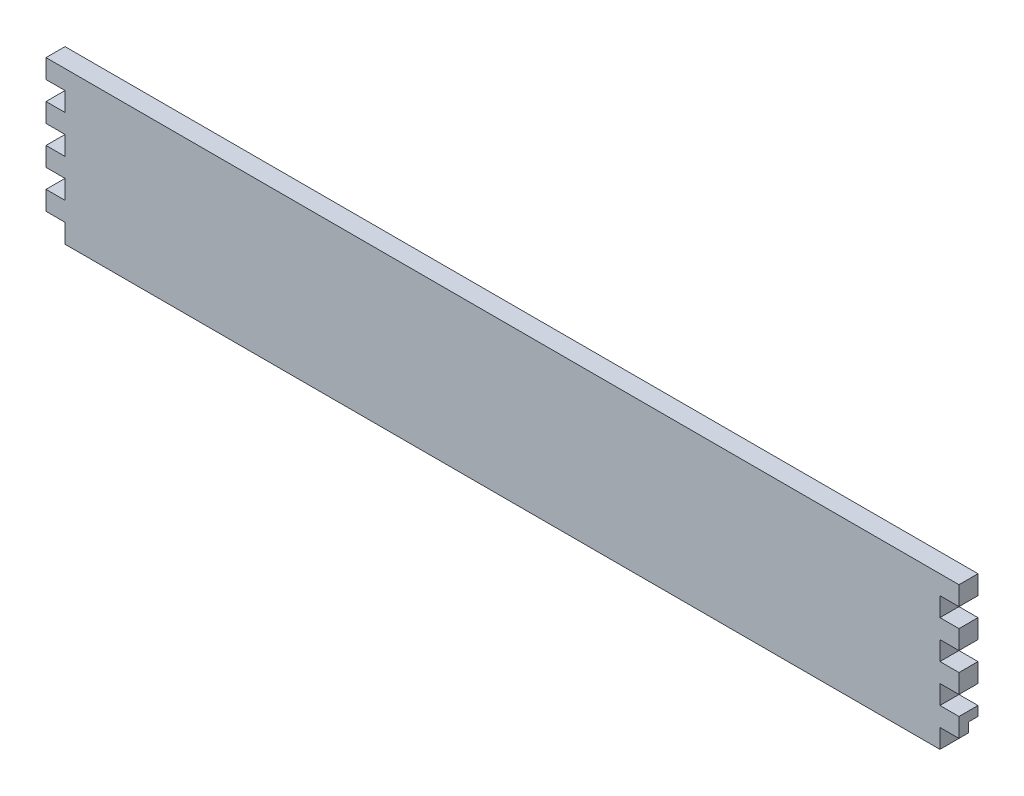
ISO-10303-21;
HEADER;
FILE_DESCRIPTION(('STEP AP214'),'2;1');
FILE_NAME('part.step','',(''),(''),'','','');
FILE_SCHEMA(('AUTOMOTIVE_DESIGN { 1 0 10303 214 1 1 1 1 }'));
ENDSEC;
DATA;
#1=APPLICATION_CONTEXT('core data for automotive mechanical design processes');
#2=APPLICATION_PROTOCOL_DEFINITION('international standard','automotive_design',2000,#1);
#3=PRODUCT_CONTEXT('',#1,'mechanical');
#4=PRODUCT('Part','Part','',(#3));
#5=PRODUCT_RELATED_PRODUCT_CATEGORY('part','',(#4));
#6=PRODUCT_DEFINITION_FORMATION('','',#4);
#7=PRODUCT_DEFINITION_CONTEXT('part definition',#1,'design');
#8=PRODUCT_DEFINITION('design','',#6,#7);
#9=PRODUCT_DEFINITION_SHAPE('','',#8);
#10=(LENGTH_UNIT() NAMED_UNIT(*) SI_UNIT(.MILLI.,.METRE.));
#11=(NAMED_UNIT(*) PLANE_ANGLE_UNIT() SI_UNIT($,.RADIAN.));
#12=(NAMED_UNIT(*) SI_UNIT($,.STERADIAN.) SOLID_ANGLE_UNIT());
#13=UNCERTAINTY_MEASURE_WITH_UNIT(LENGTH_MEASURE(1.E-05),#10,'distance_accuracy_value','');
#14=(GEOMETRIC_REPRESENTATION_CONTEXT(3) GLOBAL_UNCERTAINTY_ASSIGNED_CONTEXT((#13)) GLOBAL_UNIT_ASSIGNED_CONTEXT((#10,
#11,#12)) REPRESENTATION_CONTEXT('',''));
#15=CARTESIAN_POINT('',(0.,0.,0.));
#16=DIRECTION('',(0.,0.,1.));
#17=DIRECTION('',(1.,0.,0.));
#18=AXIS2_PLACEMENT_3D('',#15,#16,#17);
#19=CARTESIAN_POINT('',(0.,0.,12.7));
#20=DIRECTION('',(-1.,0.,0.));
#21=DIRECTION('',(0.,-1.,0.));
#22=AXIS2_PLACEMENT_3D('',#19,#20,#21);
#23=PLANE('',#22);
#24=DIRECTION('',(0.,1.,0.));
#25=VECTOR('',#24,1.);
#26=CARTESIAN_POINT('',(0.,0.,0.));
#27=LINE('',#26,#25);
#28=CARTESIAN_POINT('',(-2.22044604925031E-13,19.0499999999999,0.));
#29=VERTEX_POINT('',#28);
#30=CARTESIAN_POINT('',(0.,25.4,0.));
#31=VERTEX_POINT('',#30);
#32=EDGE_CURVE('E310',#29,#31,#27,.T.);
#33=ORIENTED_EDGE('',*,*,#32,.F.);
#34=DIRECTION('',(0.,0.,1.));
#35=VECTOR('',#34,1.);
#36=CARTESIAN_POINT('',(0.,19.0499999999999,12.7));
#37=LINE('',#36,#35);
#38=CARTESIAN_POINT('',(0.,19.0499999999999,6.35));
#39=VERTEX_POINT('',#38);
#40=EDGE_CURVE('E434',#29,#39,#37,.T.);
#41=ORIENTED_EDGE('',*,*,#40,.T.);
#42=DIRECTION('',(0.,-1.,0.));
#43=VECTOR('',#42,1.);
#44=CARTESIAN_POINT('',(0.,0.,6.35));
#45=LINE('',#44,#43);
#46=CARTESIAN_POINT('',(0.,12.6999999999999,6.35));
#47=VERTEX_POINT('',#46);
#48=EDGE_CURVE('E271',#39,#47,#45,.T.);
#49=ORIENTED_EDGE('',*,*,#48,.T.);
#50=DIRECTION('',(0.,0.,-1.));
#51=VECTOR('',#50,1.);
#52=CARTESIAN_POINT('',(0.,12.7,12.7));
#53=LINE('',#52,#51);
#54=CARTESIAN_POINT('',(0.,12.7,12.7));
#55=VERTEX_POINT('',#54);
#56=EDGE_CURVE('E382',#55,#47,#53,.T.);
#57=ORIENTED_EDGE('',*,*,#56,.F.);
#58=DIRECTION('',(0.,1.,0.));
#59=VECTOR('',#58,1.);
#60=CARTESIAN_POINT('',(0.,0.,12.7));
#61=LINE('',#60,#59);
#62=CARTESIAN_POINT('',(0.,25.4,12.7));
#63=VERTEX_POINT('',#62);
#64=EDGE_CURVE('E613',#55,#63,#61,.T.);
#65=ORIENTED_EDGE('',*,*,#64,.T.);
#66=DIRECTION('',(0.,0.,-1.));
#67=VECTOR('',#66,1.);
#68=CARTESIAN_POINT('',(0.,25.4,12.7));
#69=LINE('',#68,#67);
#70=EDGE_CURVE('E385',#63,#31,#69,.T.);
#71=ORIENTED_EDGE('',*,*,#70,.T.);
#72=EDGE_LOOP('',(#33,#41,#49,#57,#65,#71));
#73=FACE_BOUND('',#72,.T.);
#74=ADVANCED_FACE('F33',(#73),#23,.T.);
#75=CARTESIAN_POINT('',(0.,12.7,12.7));
#76=DIRECTION('',(0.,1.,0.));
#77=DIRECTION('',(0.,0.,1.));
#78=AXIS2_PLACEMENT_3D('',#75,#76,#77);
#79=PLANE('',#78);
#80=DIRECTION('',(1.,0.,0.));
#81=VECTOR('',#80,1.);
#82=CARTESIAN_POINT('',(626.282293205179,12.7,6.35));
#83=LINE('',#82,#81);
#84=CARTESIAN_POINT('',(12.7,12.6999999999999,6.35));
#85=VERTEX_POINT('',#84);
#86=EDGE_CURVE('E651',#47,#85,#83,.T.);
#87=ORIENTED_EDGE('',*,*,#86,.T.);
#88=DIRECTION('',(0.,0.,-1.));
#89=VECTOR('',#88,1.);
#90=CARTESIAN_POINT('',(12.7,12.7,12.7));
#91=LINE('',#90,#89);
#92=CARTESIAN_POINT('',(12.7,12.7,12.7));
#93=VERTEX_POINT('',#92);
#94=EDGE_CURVE('E379',#93,#85,#91,.T.);
#95=ORIENTED_EDGE('',*,*,#94,.F.);
#96=DIRECTION('',(1.,0.,0.));
#97=VECTOR('',#96,1.);
#98=CARTESIAN_POINT('',(0.,12.7,12.7));
#99=LINE('',#98,#97);
#100=EDGE_CURVE('E616',#55,#93,#99,.T.);
#101=ORIENTED_EDGE('',*,*,#100,.F.);
#102=ORIENTED_EDGE('',*,*,#56,.T.);
#103=EDGE_LOOP('',(#87,#95,#101,#102));
#104=FACE_BOUND('',#103,.T.);
#105=ADVANCED_FACE('F499',(#104),#79,.F.);
#106=CARTESIAN_POINT('',(0.,12.7000000000036,12.7));
#107=DIRECTION('',(0.,-1.,0.));
#108=DIRECTION('',(1.,0.,0.));
#109=AXIS2_PLACEMENT_3D('',#106,#107,#108);
#110=PLANE('',#109);
#111=DIRECTION('',(0.,0.,-1.));
#112=VECTOR('',#111,1.);
#113=CARTESIAN_POINT('',(596.9,12.7000000000001,12.7));
#114=LINE('',#113,#112);
#115=CARTESIAN_POINT('',(596.9,12.7000000000001,12.7));
#116=VERTEX_POINT('',#115);
#117=CARTESIAN_POINT('',(596.9,12.7,6.35));
#118=VERTEX_POINT('',#117);
#119=EDGE_CURVE('E371',#116,#118,#114,.T.);
#120=ORIENTED_EDGE('',*,*,#119,.T.);
#121=CARTESIAN_POINT('',(609.6,12.7,6.35));
#122=VERTEX_POINT('',#121);
#123=EDGE_CURVE('E634',#118,#122,#83,.T.);
#124=ORIENTED_EDGE('',*,*,#123,.T.);
#125=DIRECTION('',(0.,0.,-1.));
#126=VECTOR('',#125,1.);
#127=CARTESIAN_POINT('',(609.6,12.7,12.7));
#128=LINE('',#127,#126);
#129=CARTESIAN_POINT('',(609.6,12.7,12.7));
#130=VERTEX_POINT('',#129);
#131=EDGE_CURVE('E368',#130,#122,#128,.T.);
#132=ORIENTED_EDGE('',*,*,#131,.F.);
#133=DIRECTION('',(-1.,0.,0.));
#134=VECTOR('',#133,1.);
#135=CARTESIAN_POINT('',(0.,12.7000000000036,12.7));
#136=LINE('',#135,#134);
#137=EDGE_CURVE('E458',#130,#116,#136,.T.);
#138=ORIENTED_EDGE('',*,*,#137,.T.);
#139=EDGE_LOOP('',(#120,#124,#132,#138));
#140=FACE_BOUND('',#139,.T.);
#141=ADVANCED_FACE('F506',(#140),#110,.T.);
#142=CARTESIAN_POINT('',(609.6,0.,12.7));
#143=DIRECTION('',(-1.,0.,0.));
#144=DIRECTION('',(0.,0.,1.));
#145=AXIS2_PLACEMENT_3D('',#142,#143,#144);
#146=PLANE('',#145);
#147=DIRECTION('',(0.,0.,1.));
#148=VECTOR('',#147,1.);
#149=CARTESIAN_POINT('',(609.6,19.05,12.7));
#150=LINE('',#149,#148);
#151=CARTESIAN_POINT('',(609.6,19.05,0.));
#152=VERTEX_POINT('',#151);
#153=CARTESIAN_POINT('',(609.6,19.05,6.35));
#154=VERTEX_POINT('',#153);
#155=EDGE_CURVE('E430',#152,#154,#150,.T.);
#156=ORIENTED_EDGE('',*,*,#155,.F.);
#157=DIRECTION('',(0.,1.,0.));
#158=VECTOR('',#157,1.);
#159=CARTESIAN_POINT('',(609.6,0.,0.));
#160=LINE('',#159,#158);
#161=CARTESIAN_POINT('',(609.6,25.4,0.));
#162=VERTEX_POINT('',#161);
#163=EDGE_CURVE('E320',#152,#162,#160,.T.);
#164=ORIENTED_EDGE('',*,*,#163,.T.);
#165=DIRECTION('',(0.,0.,-1.));
#166=VECTOR('',#165,1.);
#167=CARTESIAN_POINT('',(609.6,25.4,12.7));
#168=LINE('',#167,#166);
#169=CARTESIAN_POINT('',(609.6,25.4,12.7));
#170=VERTEX_POINT('',#169);
#171=EDGE_CURVE('E365',#170,#162,#168,.T.);
#172=ORIENTED_EDGE('',*,*,#171,.F.);
#173=DIRECTION('',(0.,1.,0.));
#174=VECTOR('',#173,1.);
#175=CARTESIAN_POINT('',(609.6,0.,12.7));
#176=LINE('',#175,#174);
#177=EDGE_CURVE('E456',#130,#170,#176,.T.);
#178=ORIENTED_EDGE('',*,*,#177,.F.);
#179=ORIENTED_EDGE('',*,*,#131,.T.);
#180=DIRECTION('',(0.,-1.,0.));
#181=VECTOR('',#180,1.);
#182=CARTESIAN_POINT('',(609.6,0.,6.35));
#183=LINE('',#182,#181);
#184=EDGE_CURVE('E11',#154,#122,#183,.T.);
#185=ORIENTED_EDGE('',*,*,#184,.F.);
#186=EDGE_LOOP('',(#156,#164,#172,#178,#179,#185));
#187=FACE_BOUND('',#186,.T.);
#188=ADVANCED_FACE('F442',(#187),#146,.F.);
#189=CARTESIAN_POINT('',(0.,0.,0.));
#190=DIRECTION('',(0.,0.,1.));
#191=DIRECTION('',(1.,0.,0.));
#192=AXIS2_PLACEMENT_3D('',#189,#190,#191);
#193=PLANE('',#192);
#194=DIRECTION('',(1.,0.,0.));
#195=VECTOR('',#194,1.);
#196=CARTESIAN_POINT('',(0.,19.0499999999999,0.));
#197=LINE('',#196,#195);
#198=EDGE_CURVE('E42',#29,#152,#197,.T.);
#199=ORIENTED_EDGE('',*,*,#198,.F.);
#200=ORIENTED_EDGE('',*,*,#32,.T.);
#201=DIRECTION('',(1.,0.,0.));
#202=VECTOR('',#201,1.);
#203=CARTESIAN_POINT('',(0.,25.4,0.));
#204=LINE('',#203,#202);
#205=CARTESIAN_POINT('',(12.7,25.4,0.));
#206=VERTEX_POINT('',#205);
#207=EDGE_CURVE('E307',#31,#206,#204,.T.);
#208=ORIENTED_EDGE('',*,*,#207,.T.);
#209=DIRECTION('',(0.,-1.,0.));
#210=VECTOR('',#209,1.);
#211=CARTESIAN_POINT('',(12.7,0.,0.));
#212=LINE('',#211,#210);
#213=CARTESIAN_POINT('',(12.6999999999999,38.1,0.));
#214=VERTEX_POINT('',#213);
#215=EDGE_CURVE('E304',#214,#206,#212,.T.);
#216=ORIENTED_EDGE('',*,*,#215,.F.);
#217=DIRECTION('',(1.,0.,0.));
#218=VECTOR('',#217,1.);
#219=CARTESIAN_POINT('',(0.,38.1,0.));
#220=LINE('',#219,#218);
#221=CARTESIAN_POINT('',(0.,38.1,0.));
#222=VERTEX_POINT('',#221);
#223=EDGE_CURVE('E302',#222,#214,#220,.T.);
#224=ORIENTED_EDGE('',*,*,#223,.F.);
#225=DIRECTION('',(0.,1.,0.));
#226=VECTOR('',#225,1.);
#227=CARTESIAN_POINT('',(0.,0.,0.));
#228=LINE('',#227,#226);
#229=CARTESIAN_POINT('',(-1.33025439105324E-13,50.8,0.));
#230=VERTEX_POINT('',#229);
#231=EDGE_CURVE('E299',#222,#230,#228,.T.);
#232=ORIENTED_EDGE('',*,*,#231,.T.);
#233=DIRECTION('',(1.,0.,0.));
#234=VECTOR('',#233,1.);
#235=CARTESIAN_POINT('',(0.,50.8,0.));
#236=LINE('',#235,#234);
#237=CARTESIAN_POINT('',(12.6999999999999,50.8,0.));
#238=VERTEX_POINT('',#237);
#239=EDGE_CURVE('E296',#230,#238,#236,.T.);
#240=ORIENTED_EDGE('',*,*,#239,.T.);
#241=DIRECTION('',(0.,-1.,0.));
#242=VECTOR('',#241,1.);
#243=CARTESIAN_POINT('',(12.7,0.,0.));
#244=LINE('',#243,#242);
#245=CARTESIAN_POINT('',(12.6999999999998,63.5,0.));
#246=VERTEX_POINT('',#245);
#247=EDGE_CURVE('E293',#246,#238,#244,.T.);
#248=ORIENTED_EDGE('',*,*,#247,.F.);
#249=DIRECTION('',(1.,0.,0.));
#250=VECTOR('',#249,1.);
#251=CARTESIAN_POINT('',(0.,63.5,0.));
#252=LINE('',#251,#250);
#253=CARTESIAN_POINT('',(-1.77367249934617E-13,63.5,0.));
#254=VERTEX_POINT('',#253);
#255=EDGE_CURVE('E291',#254,#246,#252,.T.);
#256=ORIENTED_EDGE('',*,*,#255,.F.);
#257=DIRECTION('',(0.,1.,0.));
#258=VECTOR('',#257,1.);
#259=CARTESIAN_POINT('',(0.,0.,0.));
#260=LINE('',#259,#258);
#261=CARTESIAN_POINT('',(-2.21709067381355E-13,76.2,0.));
#262=VERTEX_POINT('',#261);
#263=EDGE_CURVE('E288',#254,#262,#260,.T.);
#264=ORIENTED_EDGE('',*,*,#263,.T.);
#265=DIRECTION('',(1.,0.,0.));
#266=VECTOR('',#265,1.);
#267=CARTESIAN_POINT('',(0.,76.2,0.));
#268=LINE('',#267,#266);
#269=CARTESIAN_POINT('',(12.6999999999998,76.2,0.));
#270=VERTEX_POINT('',#269);
#271=EDGE_CURVE('E285',#262,#270,#268,.T.);
#272=ORIENTED_EDGE('',*,*,#271,.T.);
#273=DIRECTION('',(0.,-1.,0.));
#274=VECTOR('',#273,1.);
#275=CARTESIAN_POINT('',(12.7,0.,0.));
#276=LINE('',#275,#274);
#277=CARTESIAN_POINT('',(12.6999999999997,88.9,0.));
#278=VERTEX_POINT('',#277);
#279=EDGE_CURVE('E282',#278,#270,#276,.T.);
#280=ORIENTED_EDGE('',*,*,#279,.F.);
#281=DIRECTION('',(1.,0.,0.));
#282=VECTOR('',#281,1.);
#283=CARTESIAN_POINT('',(0.,88.9,0.));
#284=LINE('',#283,#282);
#285=CARTESIAN_POINT('',(-2.66050878210648E-13,88.9,0.));
#286=VERTEX_POINT('',#285);
#287=EDGE_CURVE('E280',#286,#278,#284,.T.);
#288=ORIENTED_EDGE('',*,*,#287,.F.);
#289=DIRECTION('',(0.,1.,0.));
#290=VECTOR('',#289,1.);
#291=CARTESIAN_POINT('',(-2.12840702415877E-12,0.,0.));
#292=LINE('',#291,#290);
#293=CARTESIAN_POINT('',(0.,101.6,0.));
#294=VERTEX_POINT('',#293);
#295=EDGE_CURVE('E277',#286,#294,#292,.T.);
#296=ORIENTED_EDGE('',*,*,#295,.T.);
#297=DIRECTION('',(1.,0.,0.));
#298=VECTOR('',#297,1.);
#299=CARTESIAN_POINT('',(0.,101.6,0.));
#300=LINE('',#299,#298);
#301=CARTESIAN_POINT('',(609.6,101.6,0.));
#302=VERTEX_POINT('',#301);
#303=EDGE_CURVE('E274',#294,#302,#300,.T.);
#304=ORIENTED_EDGE('',*,*,#303,.T.);
#305=DIRECTION('',(0.,1.,0.));
#306=VECTOR('',#305,1.);
#307=CARTESIAN_POINT('',(609.599999999998,-1.06581410364015E-11,0.));
#308=LINE('',#307,#306);
#309=CARTESIAN_POINT('',(609.6,88.9,0.));
#310=VERTEX_POINT('',#309);
#311=EDGE_CURVE('E270',#310,#302,#308,.T.);
#312=ORIENTED_EDGE('',*,*,#311,.F.);
#313=DIRECTION('',(-1.,0.,0.));
#314=VECTOR('',#313,1.);
#315=CARTESIAN_POINT('',(4.85722573273522E-13,88.9000000000033,0.));
#316=LINE('',#315,#314);
#317=CARTESIAN_POINT('',(596.9,88.9000000000001,0.));
#318=VERTEX_POINT('',#317);
#319=EDGE_CURVE('E268',#310,#318,#316,.T.);
#320=ORIENTED_EDGE('',*,*,#319,.T.);
#321=DIRECTION('',(0.,-1.,0.));
#322=VECTOR('',#321,1.);
#323=CARTESIAN_POINT('',(596.9,0.,0.));
#324=LINE('',#323,#322);
#325=CARTESIAN_POINT('',(596.9,76.2000000000001,0.));
#326=VERTEX_POINT('',#325);
#327=EDGE_CURVE('E345',#318,#326,#324,.T.);
#328=ORIENTED_EDGE('',*,*,#327,.T.);
#329=DIRECTION('',(-1.,0.,0.));
#330=VECTOR('',#329,1.);
#331=CARTESIAN_POINT('',(4.1633363423445E-13,76.2000000000033,0.));
#332=LINE('',#331,#330);
#333=CARTESIAN_POINT('',(609.6,76.2,0.));
#334=VERTEX_POINT('',#333);
#335=EDGE_CURVE('E343',#334,#326,#332,.T.);
#336=ORIENTED_EDGE('',*,*,#335,.F.);
#337=DIRECTION('',(0.,1.,0.));
#338=VECTOR('',#337,1.);
#339=CARTESIAN_POINT('',(609.6,0.,0.));
#340=LINE('',#339,#338);
#341=CARTESIAN_POINT('',(609.6,63.5,0.));
#342=VERTEX_POINT('',#341);
#343=EDGE_CURVE('E257',#342,#334,#340,.T.);
#344=ORIENTED_EDGE('',*,*,#343,.F.);
#345=DIRECTION('',(-1.,0.,0.));
#346=VECTOR('',#345,1.);
#347=CARTESIAN_POINT('',(3.46944695195378E-13,63.5000000000033,0.));
#348=LINE('',#347,#346);
#349=CARTESIAN_POINT('',(596.9,63.5000000000001,0.));
#350=VERTEX_POINT('',#349);
#351=EDGE_CURVE('E339',#342,#350,#348,.T.);
#352=ORIENTED_EDGE('',*,*,#351,.T.);
#353=DIRECTION('',(0.,-1.,0.));
#354=VECTOR('',#353,1.);
#355=CARTESIAN_POINT('',(596.9,5.21804821573824E-12,0.));
#356=LINE('',#355,#354);
#357=CARTESIAN_POINT('',(596.9,50.8000000000001,0.));
#358=VERTEX_POINT('',#357);
#359=EDGE_CURVE('E336',#350,#358,#356,.T.);
#360=ORIENTED_EDGE('',*,*,#359,.T.);
#361=DIRECTION('',(-1.,0.,0.));
#362=VECTOR('',#361,1.);
#363=CARTESIAN_POINT('',(3.05311331771939E-13,50.8000000000037,0.));
#364=LINE('',#363,#362);
#365=CARTESIAN_POINT('',(609.6,50.8,0.));
#366=VERTEX_POINT('',#365);
#367=EDGE_CURVE('E333',#366,#358,#364,.T.);
#368=ORIENTED_EDGE('',*,*,#367,.F.);
#369=DIRECTION('',(0.,1.,0.));
#370=VECTOR('',#369,1.);
#371=CARTESIAN_POINT('',(609.6,0.,0.));
#372=LINE('',#371,#370);
#373=CARTESIAN_POINT('',(609.6,38.1,0.));
#374=VERTEX_POINT('',#373);
#375=EDGE_CURVE('E331',#374,#366,#372,.T.);
#376=ORIENTED_EDGE('',*,*,#375,.F.);
#377=DIRECTION('',(-1.,0.,0.));
#378=VECTOR('',#377,1.);
#379=CARTESIAN_POINT('',(2.2898349882896E-13,38.1000000000037,0.));
#380=LINE('',#379,#378);
#381=CARTESIAN_POINT('',(596.9,38.1000000000001,0.));
#382=VERTEX_POINT('',#381);
#383=EDGE_CURVE('E328',#374,#382,#380,.T.);
#384=ORIENTED_EDGE('',*,*,#383,.T.);
#385=DIRECTION('',(0.,-1.,0.));
#386=VECTOR('',#385,1.);
#387=CARTESIAN_POINT('',(596.9,0.,0.));
#388=LINE('',#387,#386);
#389=CARTESIAN_POINT('',(596.9,25.4000000000001,0.));
#390=VERTEX_POINT('',#389);
#391=EDGE_CURVE('E325',#382,#390,#388,.T.);
#392=ORIENTED_EDGE('',*,*,#391,.T.);
#393=DIRECTION('',(-1.,0.,0.));
#394=VECTOR('',#393,1.);
#395=CARTESIAN_POINT('',(1.45716771982071E-13,25.4000000000035,0.));
#396=LINE('',#395,#394);
#397=EDGE_CURVE('E322',#162,#390,#396,.T.);
#398=ORIENTED_EDGE('',*,*,#397,.F.);
#399=ORIENTED_EDGE('',*,*,#163,.F.);
#400=EDGE_LOOP('',(#199,#200,#208,#216,#224,#232,#240,#248,#256,#264,#272,#280,#288,#296,#304,
#312,#320,#328,#336,#344,#352,#360,#368,#376,#384,#392,#398,#399));
#401=FACE_BOUND('',#400,.T.);
#402=ADVANCED_FACE('F447',(#401),#193,.F.);
#403=DIRECTION('',(-1.,0.,0.));
#404=VECTOR('',#403,1.);
#405=CARTESIAN_POINT('',(0.,12.6999999999999,0.));
#406=LINE('',#405,#404);
#407=CARTESIAN_POINT('',(596.9,12.7000000000001,0.));
#408=VERTEX_POINT('',#407);
#409=CARTESIAN_POINT('',(12.7,12.6999999999999,0.));
#410=VERTEX_POINT('',#409);
#411=EDGE_CURVE('E418',#408,#410,#406,.T.);
#412=ORIENTED_EDGE('',*,*,#411,.F.);
#413=DIRECTION('',(0.,-1.,0.));
#414=VECTOR('',#413,1.);
#415=CARTESIAN_POINT('',(596.9,0.,0.));
#416=LINE('',#415,#414);
#417=CARTESIAN_POINT('',(596.9,0.,0.));
#418=VERTEX_POINT('',#417);
#419=EDGE_CURVE('E317',#408,#418,#416,.T.);
#420=ORIENTED_EDGE('',*,*,#419,.T.);
#421=DIRECTION('',(1.,0.,0.));
#422=VECTOR('',#421,1.);
#423=CARTESIAN_POINT('',(0.,0.,0.));
#424=LINE('',#423,#422);
#425=CARTESIAN_POINT('',(12.7,0.,0.));
#426=VERTEX_POINT('',#425);
#427=EDGE_CURVE('E314',#426,#418,#424,.T.);
#428=ORIENTED_EDGE('',*,*,#427,.F.);
#429=DIRECTION('',(0.,-1.,0.));
#430=VECTOR('',#429,1.);
#431=CARTESIAN_POINT('',(12.7,0.,0.));
#432=LINE('',#431,#430);
#433=EDGE_CURVE('E312',#410,#426,#432,.T.);
#434=ORIENTED_EDGE('',*,*,#433,.F.);
#435=EDGE_LOOP('',(#412,#420,#428,#434));
#436=FACE_BOUND('',#435,.T.);
#437=ADVANCED_FACE('F569',(#436),#193,.F.);
#438=CARTESIAN_POINT('',(4.85722573273522E-13,88.9000000000033,12.7));
#439=DIRECTION('',(0.,-1.,0.));
#440=DIRECTION('',(1.,0.,0.));
#441=AXIS2_PLACEMENT_3D('',#438,#439,#440);
#442=PLANE('',#441);
#443=ORIENTED_EDGE('',*,*,#319,.F.);
#444=DIRECTION('',(0.,0.,-1.));
#445=VECTOR('',#444,1.);
#446=CARTESIAN_POINT('',(609.6,88.9,12.7));
#447=LINE('',#446,#445);
#448=CARTESIAN_POINT('',(609.6,88.9,12.7));
#449=VERTEX_POINT('',#448);
#450=EDGE_CURVE('E150',#449,#310,#447,.T.);
#451=ORIENTED_EDGE('',*,*,#450,.F.);
#452=DIRECTION('',(-1.,0.,0.));
#453=VECTOR('',#452,1.);
#454=CARTESIAN_POINT('',(4.85722573273522E-13,88.9000000000033,12.7));
#455=LINE('',#454,#453);
#456=CARTESIAN_POINT('',(596.9,88.9000000000001,12.7));
#457=VERTEX_POINT('',#456);
#458=EDGE_CURVE('E348',#449,#457,#455,.T.);
#459=ORIENTED_EDGE('',*,*,#458,.T.);
#460=DIRECTION('',(0.,0.,-1.));
#461=VECTOR('',#460,1.);
#462=CARTESIAN_POINT('',(596.9,88.9000000000001,12.7));
#463=LINE('',#462,#461);
#464=EDGE_CURVE('E50',#457,#318,#463,.T.);
#465=ORIENTED_EDGE('',*,*,#464,.T.);
#466=EDGE_LOOP('',(#443,#451,#459,#465));
#467=FACE_BOUND('',#466,.T.);
#468=ADVANCED_FACE('F35',(#467),#442,.T.);
#469=CARTESIAN_POINT('',(609.599999999998,-1.06581410364015E-11,12.7));
#470=DIRECTION('',(-1.,0.,0.));
#471=DIRECTION('',(0.,-1.,0.));
#472=AXIS2_PLACEMENT_3D('',#469,#470,#471);
#473=PLANE('',#472);
#474=ORIENTED_EDGE('',*,*,#311,.T.);
#475=DIRECTION('',(0.,0.,-1.));
#476=VECTOR('',#475,1.);
#477=CARTESIAN_POINT('',(609.6,101.6,12.7));
#478=LINE('',#477,#476);
#479=CARTESIAN_POINT('',(609.6,101.6,12.7));
#480=VERTEX_POINT('',#479);
#481=EDGE_CURVE('E415',#480,#302,#478,.T.);
#482=ORIENTED_EDGE('',*,*,#481,.F.);
#483=DIRECTION('',(0.,1.,0.));
#484=VECTOR('',#483,1.);
#485=CARTESIAN_POINT('',(609.599999999998,-1.06581410364015E-11,12.7));
#486=LINE('',#485,#484);
#487=EDGE_CURVE('E580',#449,#480,#486,.T.);
#488=ORIENTED_EDGE('',*,*,#487,.F.);
#489=ORIENTED_EDGE('',*,*,#450,.T.);
#490=EDGE_LOOP('',(#474,#482,#488,#489));
#491=FACE_BOUND('',#490,.T.);
#492=ADVANCED_FACE('F562',(#491),#473,.F.);
#493=CARTESIAN_POINT('',(0.,101.6,12.7));
#494=DIRECTION('',(0.,1.,0.));
#495=DIRECTION('',(0.,0.,1.));
#496=AXIS2_PLACEMENT_3D('',#493,#494,#495);
#497=PLANE('',#496);
#498=ORIENTED_EDGE('',*,*,#303,.F.);
#499=DIRECTION('',(0.,0.,-1.));
#500=VECTOR('',#499,1.);
#501=CARTESIAN_POINT('',(0.,101.6,12.7));
#502=LINE('',#501,#500);
#503=CARTESIAN_POINT('',(0.,101.6,12.7));
#504=VERTEX_POINT('',#503);
#505=EDGE_CURVE('E413',#504,#294,#502,.T.);
#506=ORIENTED_EDGE('',*,*,#505,.F.);
#507=DIRECTION('',(1.,0.,0.));
#508=VECTOR('',#507,1.);
#509=CARTESIAN_POINT('',(0.,101.6,12.7));
#510=LINE('',#509,#508);
#511=EDGE_CURVE('E576',#504,#480,#510,.T.);
#512=ORIENTED_EDGE('',*,*,#511,.T.);
#513=ORIENTED_EDGE('',*,*,#481,.T.);
#514=EDGE_LOOP('',(#498,#506,#512,#513));
#515=FACE_BOUND('',#514,.T.);
#516=ADVANCED_FACE('F559',(#515),#497,.T.);
#517=CARTESIAN_POINT('',(-2.12840702415877E-12,0.,12.7));
#518=DIRECTION('',(-1.,0.,0.));
#519=DIRECTION('',(0.,-1.,0.));
#520=AXIS2_PLACEMENT_3D('',#517,#518,#519);
#521=PLANE('',#520);
#522=ORIENTED_EDGE('',*,*,#295,.F.);
#523=DIRECTION('',(0.,0.,-1.));
#524=VECTOR('',#523,1.);
#525=CARTESIAN_POINT('',(-2.66050878210648E-13,88.9,12.7));
#526=LINE('',#525,#524);
#527=CARTESIAN_POINT('',(-2.66050878210648E-13,88.9,12.7));
#528=VERTEX_POINT('',#527);
#529=EDGE_CURVE('E411',#528,#286,#526,.T.);
#530=ORIENTED_EDGE('',*,*,#529,.F.);
#531=DIRECTION('',(0.,1.,0.));
#532=VECTOR('',#531,1.);
#533=CARTESIAN_POINT('',(-2.12840702415877E-12,0.,12.7));
#534=LINE('',#533,#532);
#535=EDGE_CURVE('E579',#528,#504,#534,.T.);
#536=ORIENTED_EDGE('',*,*,#535,.T.);
#537=ORIENTED_EDGE('',*,*,#505,.T.);
#538=EDGE_LOOP('',(#522,#530,#536,#537));
#539=FACE_BOUND('',#538,.T.);
#540=ADVANCED_FACE('F555',(#539),#521,.T.);
#541=CARTESIAN_POINT('',(0.,88.9,12.7));
#542=DIRECTION('',(0.,1.,0.));
#543=DIRECTION('',(0.,0.,1.));
#544=AXIS2_PLACEMENT_3D('',#541,#542,#543);
#545=PLANE('',#544);
#546=ORIENTED_EDGE('',*,*,#287,.T.);
#547=DIRECTION('',(0.,0.,-1.));
#548=VECTOR('',#547,1.);
#549=CARTESIAN_POINT('',(12.6999999999997,88.9,12.7));
#550=LINE('',#549,#548);
#551=CARTESIAN_POINT('',(12.6999999999997,88.9,12.7));
#552=VERTEX_POINT('',#551);
#553=EDGE_CURVE('E408',#552,#278,#550,.T.);
#554=ORIENTED_EDGE('',*,*,#553,.F.);
#555=DIRECTION('',(1.,0.,0.));
#556=VECTOR('',#555,1.);
#557=CARTESIAN_POINT('',(0.,88.9,12.7));
#558=LINE('',#557,#556);
#559=EDGE_CURVE('E582',#528,#552,#558,.T.);
#560=ORIENTED_EDGE('',*,*,#559,.F.);
#561=ORIENTED_EDGE('',*,*,#529,.T.);
#562=EDGE_LOOP('',(#546,#554,#560,#561));
#563=FACE_BOUND('',#562,.T.);
#564=ADVANCED_FACE('F551',(#563),#545,.F.);
#565=CARTESIAN_POINT('',(12.7,0.,12.7));
#566=DIRECTION('',(1.,0.,0.));
#567=DIRECTION('',(0.,1.,0.));
#568=AXIS2_PLACEMENT_3D('',#565,#566,#567);
#569=PLANE('',#568);
#570=ORIENTED_EDGE('',*,*,#279,.T.);
#571=DIRECTION('',(0.,0.,-1.));
#572=VECTOR('',#571,1.);
#573=CARTESIAN_POINT('',(12.6999999999998,76.2,12.7));
#574=LINE('',#573,#572);
#575=CARTESIAN_POINT('',(12.6999999999998,76.2,12.7));
#576=VERTEX_POINT('',#575);
#577=EDGE_CURVE('E406',#576,#270,#574,.T.);
#578=ORIENTED_EDGE('',*,*,#577,.F.);
#579=DIRECTION('',(0.,-1.,0.));
#580=VECTOR('',#579,1.);
#581=CARTESIAN_POINT('',(12.7,0.,12.7));
#582=LINE('',#581,#580);
#583=EDGE_CURVE('E588',#552,#576,#582,.T.);
#584=ORIENTED_EDGE('',*,*,#583,.F.);
#585=ORIENTED_EDGE('',*,*,#553,.T.);
#586=EDGE_LOOP('',(#570,#578,#584,#585));
#587=FACE_BOUND('',#586,.T.);
#588=ADVANCED_FACE('F547',(#587),#569,.F.);
#589=CARTESIAN_POINT('',(0.,76.2,12.7));
#590=DIRECTION('',(0.,1.,0.));
#591=DIRECTION('',(0.,0.,1.));
#592=AXIS2_PLACEMENT_3D('',#589,#590,#591);
#593=PLANE('',#592);
#594=ORIENTED_EDGE('',*,*,#271,.F.);
#595=DIRECTION('',(0.,0.,-1.));
#596=VECTOR('',#595,1.);
#597=CARTESIAN_POINT('',(-2.21709067381355E-13,76.2,12.7));
#598=LINE('',#597,#596);
#599=CARTESIAN_POINT('',(-2.21709067381355E-13,76.2,12.7));
#600=VERTEX_POINT('',#599);
#601=EDGE_CURVE('E404',#600,#262,#598,.T.);
#602=ORIENTED_EDGE('',*,*,#601,.F.);
#603=DIRECTION('',(1.,0.,0.));
#604=VECTOR('',#603,1.);
#605=CARTESIAN_POINT('',(0.,76.2,12.7));
#606=LINE('',#605,#604);
#607=EDGE_CURVE('E590',#600,#576,#606,.T.);
#608=ORIENTED_EDGE('',*,*,#607,.T.);
#609=ORIENTED_EDGE('',*,*,#577,.T.);
#610=EDGE_LOOP('',(#594,#602,#608,#609));
#611=FACE_BOUND('',#610,.T.);
#612=ADVANCED_FACE('F543',(#611),#593,.T.);
#613=CARTESIAN_POINT('',(0.,0.,12.7));
#614=DIRECTION('',(-1.,0.,0.));
#615=DIRECTION('',(0.,-1.,0.));
#616=AXIS2_PLACEMENT_3D('',#613,#614,#615);
#617=PLANE('',#616);
#618=ORIENTED_EDGE('',*,*,#263,.F.);
#619=DIRECTION('',(0.,0.,-1.));
#620=VECTOR('',#619,1.);
#621=CARTESIAN_POINT('',(-1.77367249934617E-13,63.5,12.7));
#622=LINE('',#621,#620);
#623=CARTESIAN_POINT('',(-1.77367249934617E-13,63.5,12.7));
#624=VERTEX_POINT('',#623);
#625=EDGE_CURVE('E402',#624,#254,#622,.T.);
#626=ORIENTED_EDGE('',*,*,#625,.F.);
#627=DIRECTION('',(0.,1.,0.));
#628=VECTOR('',#627,1.);
#629=CARTESIAN_POINT('',(0.,0.,12.7));
#630=LINE('',#629,#628);
#631=EDGE_CURVE('E593',#624,#600,#630,.T.);
#632=ORIENTED_EDGE('',*,*,#631,.T.);
#633=ORIENTED_EDGE('',*,*,#601,.T.);
#634=EDGE_LOOP('',(#618,#626,#632,#633));
#635=FACE_BOUND('',#634,.T.);
#636=ADVANCED_FACE('F539',(#635),#617,.T.);
#637=CARTESIAN_POINT('',(0.,63.5,12.7));
#638=DIRECTION('',(0.,1.,0.));
#639=DIRECTION('',(0.,0.,1.));
#640=AXIS2_PLACEMENT_3D('',#637,#638,#639);
#641=PLANE('',#640);
#642=ORIENTED_EDGE('',*,*,#255,.T.);
#643=DIRECTION('',(0.,0.,-1.));
#644=VECTOR('',#643,1.);
#645=CARTESIAN_POINT('',(12.6999999999998,63.5,12.7));
#646=LINE('',#645,#644);
#647=CARTESIAN_POINT('',(12.6999999999998,63.5,12.7));
#648=VERTEX_POINT('',#647);
#649=EDGE_CURVE('E399',#648,#246,#646,.T.);
#650=ORIENTED_EDGE('',*,*,#649,.F.);
#651=DIRECTION('',(1.,0.,0.));
#652=VECTOR('',#651,1.);
#653=CARTESIAN_POINT('',(0.,63.5,12.7));
#654=LINE('',#653,#652);
#655=EDGE_CURVE('E596',#624,#648,#654,.T.);
#656=ORIENTED_EDGE('',*,*,#655,.F.);
#657=ORIENTED_EDGE('',*,*,#625,.T.);
#658=EDGE_LOOP('',(#642,#650,#656,#657));
#659=FACE_BOUND('',#658,.T.);
#660=ADVANCED_FACE('F535',(#659),#641,.F.);
#661=CARTESIAN_POINT('',(12.7,0.,12.7));
#662=DIRECTION('',(1.,0.,0.));
#663=DIRECTION('',(0.,1.,0.));
#664=AXIS2_PLACEMENT_3D('',#661,#662,#663);
#665=PLANE('',#664);
#666=ORIENTED_EDGE('',*,*,#247,.T.);
#667=DIRECTION('',(0.,0.,-1.));
#668=VECTOR('',#667,1.);
#669=CARTESIAN_POINT('',(12.6999999999999,50.8,12.7));
#670=LINE('',#669,#668);
#671=CARTESIAN_POINT('',(12.6999999999999,50.8,12.7));
#672=VERTEX_POINT('',#671);
#673=EDGE_CURVE('E397',#672,#238,#670,.T.);
#674=ORIENTED_EDGE('',*,*,#673,.F.);
#675=DIRECTION('',(0.,-1.,0.));
#676=VECTOR('',#675,1.);
#677=CARTESIAN_POINT('',(12.7,0.,12.7));
#678=LINE('',#677,#676);
#679=EDGE_CURVE('E598',#648,#672,#678,.T.);
#680=ORIENTED_EDGE('',*,*,#679,.F.);
#681=ORIENTED_EDGE('',*,*,#649,.T.);
#682=EDGE_LOOP('',(#666,#674,#680,#681));
#683=FACE_BOUND('',#682,.T.);
#684=ADVANCED_FACE('F531',(#683),#665,.F.);
#685=CARTESIAN_POINT('',(0.,50.8,12.7));
#686=DIRECTION('',(0.,1.,0.));
#687=DIRECTION('',(0.,0.,1.));
#688=AXIS2_PLACEMENT_3D('',#685,#686,#687);
#689=PLANE('',#688);
#690=ORIENTED_EDGE('',*,*,#239,.F.);
#691=DIRECTION('',(0.,0.,-1.));
#692=VECTOR('',#691,1.);
#693=CARTESIAN_POINT('',(-1.33025439105324E-13,50.8,12.7));
#694=LINE('',#693,#692);
#695=CARTESIAN_POINT('',(-1.33025439105324E-13,50.8,12.7));
#696=VERTEX_POINT('',#695);
#697=EDGE_CURVE('E395',#696,#230,#694,.T.);
#698=ORIENTED_EDGE('',*,*,#697,.F.);
#699=DIRECTION('',(1.,0.,0.));
#700=VECTOR('',#699,1.);
#701=CARTESIAN_POINT('',(0.,50.8,12.7));
#702=LINE('',#701,#700);
#703=EDGE_CURVE('E600',#696,#672,#702,.T.);
#704=ORIENTED_EDGE('',*,*,#703,.T.);
#705=ORIENTED_EDGE('',*,*,#673,.T.);
#706=EDGE_LOOP('',(#690,#698,#704,#705));
#707=FACE_BOUND('',#706,.T.);
#708=ADVANCED_FACE('F527',(#707),#689,.T.);
#709=CARTESIAN_POINT('',(0.,0.,12.7));
#710=DIRECTION('',(-1.,0.,0.));
#711=DIRECTION('',(0.,-1.,0.));
#712=AXIS2_PLACEMENT_3D('',#709,#710,#711);
#713=PLANE('',#712);
#714=ORIENTED_EDGE('',*,*,#231,.F.);
#715=DIRECTION('',(0.,0.,-1.));
#716=VECTOR('',#715,1.);
#717=CARTESIAN_POINT('',(0.,38.1,12.7));
#718=LINE('',#717,#716);
#719=CARTESIAN_POINT('',(0.,38.1,12.7));
#720=VERTEX_POINT('',#719);
#721=EDGE_CURVE('E393',#720,#222,#718,.T.);
#722=ORIENTED_EDGE('',*,*,#721,.F.);
#723=DIRECTION('',(0.,1.,0.));
#724=VECTOR('',#723,1.);
#725=CARTESIAN_POINT('',(0.,0.,12.7));
#726=LINE('',#725,#724);
#727=EDGE_CURVE('E603',#720,#696,#726,.T.);
#728=ORIENTED_EDGE('',*,*,#727,.T.);
#729=ORIENTED_EDGE('',*,*,#697,.T.);
#730=EDGE_LOOP('',(#714,#722,#728,#729));
#731=FACE_BOUND('',#730,.T.);
#732=ADVANCED_FACE('F523',(#731),#713,.T.);
#733=CARTESIAN_POINT('',(0.,38.1,12.7));
#734=DIRECTION('',(0.,1.,0.));
#735=DIRECTION('',(0.,0.,1.));
#736=AXIS2_PLACEMENT_3D('',#733,#734,#735);
#737=PLANE('',#736);
#738=ORIENTED_EDGE('',*,*,#223,.T.);
#739=DIRECTION('',(0.,0.,-1.));
#740=VECTOR('',#739,1.);
#741=CARTESIAN_POINT('',(12.6999999999999,38.1,12.7));
#742=LINE('',#741,#740);
#743=CARTESIAN_POINT('',(12.6999999999999,38.1,12.7));
#744=VERTEX_POINT('',#743);
#745=EDGE_CURVE('E390',#744,#214,#742,.T.);
#746=ORIENTED_EDGE('',*,*,#745,.F.);
#747=DIRECTION('',(1.,0.,0.));
#748=VECTOR('',#747,1.);
#749=CARTESIAN_POINT('',(0.,38.1,12.7));
#750=LINE('',#749,#748);
#751=EDGE_CURVE('E606',#720,#744,#750,.T.);
#752=ORIENTED_EDGE('',*,*,#751,.F.);
#753=ORIENTED_EDGE('',*,*,#721,.T.);
#754=EDGE_LOOP('',(#738,#746,#752,#753));
#755=FACE_BOUND('',#754,.T.);
#756=ADVANCED_FACE('F519',(#755),#737,.F.);
#757=CARTESIAN_POINT('',(12.7,0.,12.7));
#758=DIRECTION('',(1.,0.,0.));
#759=DIRECTION('',(0.,1.,0.));
#760=AXIS2_PLACEMENT_3D('',#757,#758,#759);
#761=PLANE('',#760);
#762=ORIENTED_EDGE('',*,*,#215,.T.);
#763=DIRECTION('',(0.,0.,-1.));
#764=VECTOR('',#763,1.);
#765=CARTESIAN_POINT('',(12.7,25.4,12.7));
#766=LINE('',#765,#764);
#767=CARTESIAN_POINT('',(12.7,25.4,12.7));
#768=VERTEX_POINT('',#767);
#769=EDGE_CURVE('E388',#768,#206,#766,.T.);
#770=ORIENTED_EDGE('',*,*,#769,.F.);
#771=DIRECTION('',(0.,-1.,0.));
#772=VECTOR('',#771,1.);
#773=CARTESIAN_POINT('',(12.7,0.,12.7));
#774=LINE('',#773,#772);
#775=EDGE_CURVE('E608',#744,#768,#774,.T.);
#776=ORIENTED_EDGE('',*,*,#775,.F.);
#777=ORIENTED_EDGE('',*,*,#745,.T.);
#778=EDGE_LOOP('',(#762,#770,#776,#777));
#779=FACE_BOUND('',#778,.T.);
#780=ADVANCED_FACE('F515',(#779),#761,.F.);
#781=CARTESIAN_POINT('',(0.,25.4,12.7));
#782=DIRECTION('',(0.,1.,0.));
#783=DIRECTION('',(0.,0.,1.));
#784=AXIS2_PLACEMENT_3D('',#781,#782,#783);
#785=PLANE('',#784);
#786=ORIENTED_EDGE('',*,*,#207,.F.);
#787=ORIENTED_EDGE('',*,*,#70,.F.);
#788=DIRECTION('',(1.,0.,0.));
#789=VECTOR('',#788,1.);
#790=CARTESIAN_POINT('',(0.,25.4,12.7));
#791=LINE('',#790,#789);
#792=EDGE_CURVE('E610',#63,#768,#791,.T.);
#793=ORIENTED_EDGE('',*,*,#792,.T.);
#794=ORIENTED_EDGE('',*,*,#769,.T.);
#795=EDGE_LOOP('',(#786,#787,#793,#794));
#796=FACE_BOUND('',#795,.T.);
#797=ADVANCED_FACE('F511',(#796),#785,.T.);
#798=CARTESIAN_POINT('',(12.7,0.,12.7));
#799=DIRECTION('',(1.,0.,0.));
#800=DIRECTION('',(0.,1.,0.));
#801=AXIS2_PLACEMENT_3D('',#798,#799,#800);
#802=PLANE('',#801);
#803=ORIENTED_EDGE('',*,*,#433,.T.);
#804=DIRECTION('',(0.,0.,-1.));
#805=VECTOR('',#804,1.);
#806=CARTESIAN_POINT('',(12.7,0.,12.7));
#807=LINE('',#806,#805);
#808=CARTESIAN_POINT('',(12.7,0.,12.7));
#809=VERTEX_POINT('',#808);
#810=EDGE_CURVE('E376',#809,#426,#807,.T.);
#811=ORIENTED_EDGE('',*,*,#810,.F.);
#812=DIRECTION('',(0.,-1.,0.));
#813=VECTOR('',#812,1.);
#814=CARTESIAN_POINT('',(12.7,0.,12.7));
#815=LINE('',#814,#813);
#816=EDGE_CURVE('E618',#93,#809,#815,.T.);
#817=ORIENTED_EDGE('',*,*,#816,.F.);
#818=ORIENTED_EDGE('',*,*,#94,.T.);
#819=DIRECTION('',(0.,0.,1.));
#820=VECTOR('',#819,1.);
#821=CARTESIAN_POINT('',(12.7,12.6999999999999,12.7));
#822=LINE('',#821,#820);
#823=EDGE_CURVE('E444',#410,#85,#822,.T.);
#824=ORIENTED_EDGE('',*,*,#823,.F.);
#825=EDGE_LOOP('',(#803,#811,#817,#818,#824));
#826=FACE_BOUND('',#825,.T.);
#827=ADVANCED_FACE('F514',(#826),#802,.F.);
#828=CARTESIAN_POINT('',(0.,0.,12.7));
#829=DIRECTION('',(0.,1.,0.));
#830=DIRECTION('',(-1.,0.,0.));
#831=AXIS2_PLACEMENT_3D('',#828,#829,#830);
#832=PLANE('',#831);
#833=ORIENTED_EDGE('',*,*,#427,.T.);
#834=DIRECTION('',(0.,0.,-1.));
#835=VECTOR('',#834,1.);
#836=CARTESIAN_POINT('',(596.9,0.,12.7));
#837=LINE('',#836,#835);
#838=CARTESIAN_POINT('',(596.9,0.,12.7));
#839=VERTEX_POINT('',#838);
#840=EDGE_CURVE('E374',#839,#418,#837,.T.);
#841=ORIENTED_EDGE('',*,*,#840,.F.);
#842=DIRECTION('',(1.,0.,0.));
#843=VECTOR('',#842,1.);
#844=CARTESIAN_POINT('',(0.,0.,12.7));
#845=LINE('',#844,#843);
#846=EDGE_CURVE('E466',#809,#839,#845,.T.);
#847=ORIENTED_EDGE('',*,*,#846,.F.);
#848=ORIENTED_EDGE('',*,*,#810,.T.);
#849=EDGE_LOOP('',(#833,#841,#847,#848));
#850=FACE_BOUND('',#849,.T.);
#851=ADVANCED_FACE('F624',(#850),#832,.F.);
#852=CARTESIAN_POINT('',(596.9,0.,12.7));
#853=DIRECTION('',(1.,0.,0.));
#854=DIRECTION('',(0.,0.,-1.));
#855=AXIS2_PLACEMENT_3D('',#852,#853,#854);
#856=PLANE('',#855);
#857=ORIENTED_EDGE('',*,*,#419,.F.);
#858=DIRECTION('',(0.,0.,1.));
#859=VECTOR('',#858,1.);
#860=CARTESIAN_POINT('',(596.9,12.7,12.7));
#861=LINE('',#860,#859);
#862=EDGE_CURVE('E631',#408,#118,#861,.T.);
#863=ORIENTED_EDGE('',*,*,#862,.T.);
#864=ORIENTED_EDGE('',*,*,#119,.F.);
#865=DIRECTION('',(0.,-1.,0.));
#866=VECTOR('',#865,1.);
#867=CARTESIAN_POINT('',(596.9,0.,12.7));
#868=LINE('',#867,#866);
#869=EDGE_CURVE('E463',#116,#839,#868,.T.);
#870=ORIENTED_EDGE('',*,*,#869,.T.);
#871=ORIENTED_EDGE('',*,*,#840,.T.);
#872=EDGE_LOOP('',(#857,#863,#864,#870,#871));
#873=FACE_BOUND('',#872,.T.);
#874=ADVANCED_FACE('F628',(#873),#856,.T.);
#875=CARTESIAN_POINT('',(1.45716771982071E-13,25.4000000000035,12.7));
#876=DIRECTION('',(0.,-1.,0.));
#877=DIRECTION('',(1.,0.,0.));
#878=AXIS2_PLACEMENT_3D('',#875,#876,#877);
#879=PLANE('',#878);
#880=ORIENTED_EDGE('',*,*,#397,.T.);
#881=DIRECTION('',(0.,0.,-1.));
#882=VECTOR('',#881,1.);
#883=CARTESIAN_POINT('',(596.9,25.4000000000001,12.7));
#884=LINE('',#883,#882);
#885=CARTESIAN_POINT('',(596.9,25.4000000000001,12.7));
#886=VERTEX_POINT('',#885);
#887=EDGE_CURVE('E363',#886,#390,#884,.T.);
#888=ORIENTED_EDGE('',*,*,#887,.F.);
#889=DIRECTION('',(-1.,0.,0.));
#890=VECTOR('',#889,1.);
#891=CARTESIAN_POINT('',(1.45716771982071E-13,25.4000000000035,12.7));
#892=LINE('',#891,#890);
#893=EDGE_CURVE('E454',#170,#886,#892,.T.);
#894=ORIENTED_EDGE('',*,*,#893,.F.);
#895=ORIENTED_EDGE('',*,*,#171,.T.);
#896=EDGE_LOOP('',(#880,#888,#894,#895));
#897=FACE_BOUND('',#896,.T.);
#898=ADVANCED_FACE('F451',(#897),#879,.F.);
#899=CARTESIAN_POINT('',(596.9,0.,12.7));
#900=DIRECTION('',(1.,0.,0.));
#901=DIRECTION('',(0.,0.,-1.));
#902=AXIS2_PLACEMENT_3D('',#899,#900,#901);
#903=PLANE('',#902);
#904=ORIENTED_EDGE('',*,*,#391,.F.);
#905=DIRECTION('',(0.,0.,-1.));
#906=VECTOR('',#905,1.);
#907=CARTESIAN_POINT('',(596.9,38.1000000000001,12.7));
#908=LINE('',#907,#906);
#909=CARTESIAN_POINT('',(596.9,38.1000000000001,12.7));
#910=VERTEX_POINT('',#909);
#911=EDGE_CURVE('E361',#910,#382,#908,.T.);
#912=ORIENTED_EDGE('',*,*,#911,.F.);
#913=DIRECTION('',(0.,-1.,0.));
#914=VECTOR('',#913,1.);
#915=CARTESIAN_POINT('',(596.9,0.,12.7));
#916=LINE('',#915,#914);
#917=EDGE_CURVE('E471',#910,#886,#916,.T.);
#918=ORIENTED_EDGE('',*,*,#917,.T.);
#919=ORIENTED_EDGE('',*,*,#887,.T.);
#920=EDGE_LOOP('',(#904,#912,#918,#919));
#921=FACE_BOUND('',#920,.T.);
#922=ADVANCED_FACE('F815',(#921),#903,.T.);
#923=CARTESIAN_POINT('',(2.2898349882896E-13,38.1000000000037,12.7));
#924=DIRECTION('',(0.,-1.,0.));
#925=DIRECTION('',(1.,0.,0.));
#926=AXIS2_PLACEMENT_3D('',#923,#924,#925);
#927=PLANE('',#926);
#928=ORIENTED_EDGE('',*,*,#383,.F.);
#929=DIRECTION('',(0.,0.,-1.));
#930=VECTOR('',#929,1.);
#931=CARTESIAN_POINT('',(609.6,38.1,12.7));
#932=LINE('',#931,#930);
#933=CARTESIAN_POINT('',(609.6,38.1,12.7));
#934=VERTEX_POINT('',#933);
#935=EDGE_CURVE('E359',#934,#374,#932,.T.);
#936=ORIENTED_EDGE('',*,*,#935,.F.);
#937=DIRECTION('',(-1.,0.,0.));
#938=VECTOR('',#937,1.);
#939=CARTESIAN_POINT('',(2.2898349882896E-13,38.1000000000037,12.7));
#940=LINE('',#939,#938);
#941=EDGE_CURVE('E473',#934,#910,#940,.T.);
#942=ORIENTED_EDGE('',*,*,#941,.T.);
#943=ORIENTED_EDGE('',*,*,#911,.T.);
#944=EDGE_LOOP('',(#928,#936,#942,#943));
#945=FACE_BOUND('',#944,.T.);
#946=ADVANCED_FACE('F805',(#945),#927,.T.);
#947=CARTESIAN_POINT('',(609.6,0.,12.7));
#948=DIRECTION('',(-1.,0.,0.));
#949=DIRECTION('',(0.,0.,1.));
#950=AXIS2_PLACEMENT_3D('',#947,#948,#949);
#951=PLANE('',#950);
#952=ORIENTED_EDGE('',*,*,#375,.T.);
#953=DIRECTION('',(0.,0.,-1.));
#954=VECTOR('',#953,1.);
#955=CARTESIAN_POINT('',(609.6,50.8,12.7));
#956=LINE('',#955,#954);
#957=CARTESIAN_POINT('',(609.6,50.8,12.7));
#958=VERTEX_POINT('',#957);
#959=EDGE_CURVE('E356',#958,#366,#956,.T.);
#960=ORIENTED_EDGE('',*,*,#959,.F.);
#961=DIRECTION('',(0.,1.,0.));
#962=VECTOR('',#961,1.);
#963=CARTESIAN_POINT('',(609.6,0.,12.7));
#964=LINE('',#963,#962);
#965=EDGE_CURVE('E476',#934,#958,#964,.T.);
#966=ORIENTED_EDGE('',*,*,#965,.F.);
#967=ORIENTED_EDGE('',*,*,#935,.T.);
#968=EDGE_LOOP('',(#952,#960,#966,#967));
#969=FACE_BOUND('',#968,.T.);
#970=ADVANCED_FACE('F795',(#969),#951,.F.);
#971=CARTESIAN_POINT('',(3.05311331771939E-13,50.8000000000037,12.7));
#972=DIRECTION('',(0.,-1.,0.));
#973=DIRECTION('',(1.,0.,0.));
#974=AXIS2_PLACEMENT_3D('',#971,#972,#973);
#975=PLANE('',#974);
#976=ORIENTED_EDGE('',*,*,#367,.T.);
#977=DIRECTION('',(0.,0.,-1.));
#978=VECTOR('',#977,1.);
#979=CARTESIAN_POINT('',(596.9,50.8000000000001,12.7));
#980=LINE('',#979,#978);
#981=CARTESIAN_POINT('',(596.9,50.8000000000001,12.7));
#982=VERTEX_POINT('',#981);
#983=EDGE_CURVE('E354',#982,#358,#980,.T.);
#984=ORIENTED_EDGE('',*,*,#983,.F.);
#985=DIRECTION('',(-1.,0.,0.));
#986=VECTOR('',#985,1.);
#987=CARTESIAN_POINT('',(3.05311331771939E-13,50.8000000000037,12.7));
#988=LINE('',#987,#986);
#989=EDGE_CURVE('E478',#958,#982,#988,.T.);
#990=ORIENTED_EDGE('',*,*,#989,.F.);
#991=ORIENTED_EDGE('',*,*,#959,.T.);
#992=EDGE_LOOP('',(#976,#984,#990,#991));
#993=FACE_BOUND('',#992,.T.);
#994=ADVANCED_FACE('F785',(#993),#975,.F.);
#995=CARTESIAN_POINT('',(596.9,5.21804821573824E-12,12.7));
#996=DIRECTION('',(1.,0.,0.));
#997=DIRECTION('',(0.,1.,0.));
#998=AXIS2_PLACEMENT_3D('',#995,#996,#997);
#999=PLANE('',#998);
#1000=ORIENTED_EDGE('',*,*,#359,.F.);
#1001=DIRECTION('',(0.,0.,-1.));
#1002=VECTOR('',#1001,1.);
#1003=CARTESIAN_POINT('',(596.9,63.5000000000001,12.7));
#1004=LINE('',#1003,#1002);
#1005=CARTESIAN_POINT('',(596.9,63.5000000000001,12.7));
#1006=VERTEX_POINT('',#1005);
#1007=EDGE_CURVE('E352',#1006,#350,#1004,.T.);
#1008=ORIENTED_EDGE('',*,*,#1007,.F.);
#1009=DIRECTION('',(0.,-1.,0.));
#1010=VECTOR('',#1009,1.);
#1011=CARTESIAN_POINT('',(596.9,5.21804821573824E-12,12.7));
#1012=LINE('',#1011,#1010);
#1013=EDGE_CURVE('E480',#1006,#982,#1012,.T.);
#1014=ORIENTED_EDGE('',*,*,#1013,.T.);
#1015=ORIENTED_EDGE('',*,*,#983,.T.);
#1016=EDGE_LOOP('',(#1000,#1008,#1014,#1015));
#1017=FACE_BOUND('',#1016,.T.);
#1018=ADVANCED_FACE('F776',(#1017),#999,.T.);
#1019=CARTESIAN_POINT('',(3.46944695195378E-13,63.5000000000033,12.7));
#1020=DIRECTION('',(0.,-1.,0.));
#1021=DIRECTION('',(1.,0.,0.));
#1022=AXIS2_PLACEMENT_3D('',#1019,#1020,#1021);
#1023=PLANE('',#1022);
#1024=ORIENTED_EDGE('',*,*,#351,.F.);
#1025=DIRECTION('',(0.,0.,-1.));
#1026=VECTOR('',#1025,1.);
#1027=CARTESIAN_POINT('',(609.6,63.5,12.7));
#1028=LINE('',#1027,#1026);
#1029=CARTESIAN_POINT('',(609.6,63.5,12.7));
#1030=VERTEX_POINT('',#1029);
#1031=EDGE_CURVE('E260',#1030,#342,#1028,.T.);
#1032=ORIENTED_EDGE('',*,*,#1031,.F.);
#1033=DIRECTION('',(-1.,0.,0.));
#1034=VECTOR('',#1033,1.);
#1035=CARTESIAN_POINT('',(3.46944695195378E-13,63.5000000000033,12.7));
#1036=LINE('',#1035,#1034);
#1037=EDGE_CURVE('E250',#1030,#1006,#1036,.T.);
#1038=ORIENTED_EDGE('',*,*,#1037,.T.);
#1039=ORIENTED_EDGE('',*,*,#1007,.T.);
#1040=EDGE_LOOP('',(#1024,#1032,#1038,#1039));
#1041=FACE_BOUND('',#1040,.T.);
#1042=ADVANCED_FACE('F484',(#1041),#1023,.T.);
#1043=CARTESIAN_POINT('',(609.6,0.,12.7));
#1044=DIRECTION('',(-1.,0.,0.));
#1045=DIRECTION('',(0.,0.,1.));
#1046=AXIS2_PLACEMENT_3D('',#1043,#1044,#1045);
#1047=PLANE('',#1046);
#1048=ORIENTED_EDGE('',*,*,#343,.T.);
#1049=DIRECTION('',(0.,0.,-1.));
#1050=VECTOR('',#1049,1.);
#1051=CARTESIAN_POINT('',(609.6,76.2,12.7));
#1052=LINE('',#1051,#1050);
#1053=CARTESIAN_POINT('',(609.6,76.2,12.7));
#1054=VERTEX_POINT('',#1053);
#1055=EDGE_CURVE('E254',#1054,#334,#1052,.T.);
#1056=ORIENTED_EDGE('',*,*,#1055,.F.);
#1057=DIRECTION('',(0.,1.,0.));
#1058=VECTOR('',#1057,1.);
#1059=CARTESIAN_POINT('',(609.6,0.,12.7));
#1060=LINE('',#1059,#1058);
#1061=EDGE_CURVE('E241',#1030,#1054,#1060,.T.);
#1062=ORIENTED_EDGE('',*,*,#1061,.F.);
#1063=ORIENTED_EDGE('',*,*,#1031,.T.);
#1064=EDGE_LOOP('',(#1048,#1056,#1062,#1063));
#1065=FACE_BOUND('',#1064,.T.);
#1066=ADVANCED_FACE('F255',(#1065),#1047,.F.);
#1067=CARTESIAN_POINT('',(4.1633363423445E-13,76.2000000000033,12.7));
#1068=DIRECTION('',(0.,-1.,0.));
#1069=DIRECTION('',(1.,0.,0.));
#1070=AXIS2_PLACEMENT_3D('',#1067,#1068,#1069);
#1071=PLANE('',#1070);
#1072=ORIENTED_EDGE('',*,*,#335,.T.);
#1073=DIRECTION('',(0.,0.,-1.));
#1074=VECTOR('',#1073,1.);
#1075=CARTESIAN_POINT('',(596.9,76.2000000000001,12.7));
#1076=LINE('',#1075,#1074);
#1077=CARTESIAN_POINT('',(596.9,76.2000000000001,12.7));
#1078=VERTEX_POINT('',#1077);
#1079=EDGE_CURVE('E141',#1078,#326,#1076,.T.);
#1080=ORIENTED_EDGE('',*,*,#1079,.F.);
#1081=DIRECTION('',(-1.,0.,0.));
#1082=VECTOR('',#1081,1.);
#1083=CARTESIAN_POINT('',(4.1633363423445E-13,76.2000000000033,12.7));
#1084=LINE('',#1083,#1082);
#1085=EDGE_CURVE('E247',#1054,#1078,#1084,.T.);
#1086=ORIENTED_EDGE('',*,*,#1085,.F.);
#1087=ORIENTED_EDGE('',*,*,#1055,.T.);
#1088=EDGE_LOOP('',(#1072,#1080,#1086,#1087));
#1089=FACE_BOUND('',#1088,.T.);
#1090=ADVANCED_FACE('F262',(#1089),#1071,.F.);
#1091=CARTESIAN_POINT('',(596.9,0.,12.7));
#1092=DIRECTION('',(1.,0.,0.));
#1093=DIRECTION('',(0.,0.,-1.));
#1094=AXIS2_PLACEMENT_3D('',#1091,#1092,#1093);
#1095=PLANE('',#1094);
#1096=ORIENTED_EDGE('',*,*,#327,.F.);
#1097=ORIENTED_EDGE('',*,*,#464,.F.);
#1098=DIRECTION('',(0.,-1.,0.));
#1099=VECTOR('',#1098,1.);
#1100=CARTESIAN_POINT('',(596.9,0.,12.7));
#1101=LINE('',#1100,#1099);
#1102=EDGE_CURVE('E263',#457,#1078,#1101,.T.);
#1103=ORIENTED_EDGE('',*,*,#1102,.T.);
#1104=ORIENTED_EDGE('',*,*,#1079,.T.);
#1105=EDGE_LOOP('',(#1096,#1097,#1103,#1104));
#1106=FACE_BOUND('',#1105,.T.);
#1107=ADVANCED_FACE('F487',(#1106),#1095,.T.);
#1108=CARTESIAN_POINT('',(0.,0.,12.7));
#1109=DIRECTION('',(0.,0.,1.));
#1110=DIRECTION('',(1.,0.,0.));
#1111=AXIS2_PLACEMENT_3D('',#1108,#1109,#1110);
#1112=PLANE('',#1111);
#1113=ORIENTED_EDGE('',*,*,#458,.F.);
#1114=ORIENTED_EDGE('',*,*,#487,.T.);
#1115=ORIENTED_EDGE('',*,*,#511,.F.);
#1116=ORIENTED_EDGE('',*,*,#535,.F.);
#1117=ORIENTED_EDGE('',*,*,#559,.T.);
#1118=ORIENTED_EDGE('',*,*,#583,.T.);
#1119=ORIENTED_EDGE('',*,*,#607,.F.);
#1120=ORIENTED_EDGE('',*,*,#631,.F.);
#1121=ORIENTED_EDGE('',*,*,#655,.T.);
#1122=ORIENTED_EDGE('',*,*,#679,.T.);
#1123=ORIENTED_EDGE('',*,*,#703,.F.);
#1124=ORIENTED_EDGE('',*,*,#727,.F.);
#1125=ORIENTED_EDGE('',*,*,#751,.T.);
#1126=ORIENTED_EDGE('',*,*,#775,.T.);
#1127=ORIENTED_EDGE('',*,*,#792,.F.);
#1128=ORIENTED_EDGE('',*,*,#64,.F.);
#1129=ORIENTED_EDGE('',*,*,#100,.T.);
#1130=ORIENTED_EDGE('',*,*,#816,.T.);
#1131=ORIENTED_EDGE('',*,*,#846,.T.);
#1132=ORIENTED_EDGE('',*,*,#869,.F.);
#1133=ORIENTED_EDGE('',*,*,#137,.F.);
#1134=ORIENTED_EDGE('',*,*,#177,.T.);
#1135=ORIENTED_EDGE('',*,*,#893,.T.);
#1136=ORIENTED_EDGE('',*,*,#917,.F.);
#1137=ORIENTED_EDGE('',*,*,#941,.F.);
#1138=ORIENTED_EDGE('',*,*,#965,.T.);
#1139=ORIENTED_EDGE('',*,*,#989,.T.);
#1140=ORIENTED_EDGE('',*,*,#1013,.F.);
#1141=ORIENTED_EDGE('',*,*,#1037,.F.);
#1142=ORIENTED_EDGE('',*,*,#1061,.T.);
#1143=ORIENTED_EDGE('',*,*,#1085,.T.);
#1144=ORIENTED_EDGE('',*,*,#1102,.F.);
#1145=EDGE_LOOP('',(#1113,#1114,#1115,#1116,#1117,#1118,#1119,#1120,#1121,#1122,#1123,#1124,
#1125,#1126,#1127,#1128,#1129,#1130,#1131,#1132,#1133,#1134,#1135,#1136,#1137,#1138,#1139,#1140,
#1141,#1142,#1143,#1144));
#1146=FACE_BOUND('',#1145,.T.);
#1147=ADVANCED_FACE('F244',(#1146),#1112,.T.);
#1148=CARTESIAN_POINT('',(0.,0.,6.35));
#1149=DIRECTION('',(0.,0.,-1.));
#1150=DIRECTION('',(-1.,0.,0.));
#1151=AXIS2_PLACEMENT_3D('',#1148,#1149,#1150);
#1152=PLANE('',#1151);
#1153=DIRECTION('',(-1.,0.,0.));
#1154=VECTOR('',#1153,1.);
#1155=CARTESIAN_POINT('',(626.282293205179,19.05,6.35));
#1156=LINE('',#1155,#1154);
#1157=EDGE_CURVE('E649',#154,#39,#1156,.T.);
#1158=ORIENTED_EDGE('',*,*,#1157,.F.);
#1159=ORIENTED_EDGE('',*,*,#184,.T.);
#1160=ORIENTED_EDGE('',*,*,#123,.F.);
#1161=EDGE_CURVE('E658',#85,#118,#83,.T.);
#1162=ORIENTED_EDGE('',*,*,#1161,.F.);
#1163=ORIENTED_EDGE('',*,*,#86,.F.);
#1164=ORIENTED_EDGE('',*,*,#48,.F.);
#1165=EDGE_LOOP('',(#1158,#1159,#1160,#1162,#1163,#1164));
#1166=FACE_BOUND('',#1165,.T.);
#1167=ADVANCED_FACE('F494',(#1166),#1152,.T.);
#1168=CARTESIAN_POINT('',(626.282293205179,19.05,6.35));
#1169=DIRECTION('',(0.,-1.,0.));
#1170=DIRECTION('',(1.,0.,0.));
#1171=AXIS2_PLACEMENT_3D('',#1168,#1169,#1170);
#1172=PLANE('',#1171);
#1173=ORIENTED_EDGE('',*,*,#198,.T.);
#1174=ORIENTED_EDGE('',*,*,#155,.T.);
#1175=ORIENTED_EDGE('',*,*,#1157,.T.);
#1176=ORIENTED_EDGE('',*,*,#40,.F.);
#1177=EDGE_LOOP('',(#1173,#1174,#1175,#1176));
#1178=FACE_BOUND('',#1177,.T.);
#1179=ADVANCED_FACE('F427',(#1178),#1172,.T.);
#1180=CARTESIAN_POINT('',(626.282293205179,12.7,6.35));
#1181=DIRECTION('',(0.,1.,0.));
#1182=DIRECTION('',(-1.,0.,0.));
#1183=AXIS2_PLACEMENT_3D('',#1180,#1181,#1182);
#1184=PLANE('',#1183);
#1185=ORIENTED_EDGE('',*,*,#823,.T.);
#1186=ORIENTED_EDGE('',*,*,#1161,.T.);
#1187=ORIENTED_EDGE('',*,*,#862,.F.);
#1188=ORIENTED_EDGE('',*,*,#411,.T.);
#1189=EDGE_LOOP('',(#1185,#1186,#1187,#1188));
#1190=FACE_BOUND('',#1189,.T.);
#1191=ADVANCED_FACE('F668',(#1190),#1184,.T.);
#1192=CLOSED_SHELL('',(#74,#105,#141,#188,#402,#437,#468,#492,#516,#540,#564,#588,#612,#636,
#660,#684,#708,#732,#756,#780,#797,#827,#851,#874,#898,#922,#946,#970,#994,#1018,#1042,#1066,
#1090,#1107,#1147,#1167,#1179,#1191));
#1193=MANIFOLD_SOLID_BREP('B2',#1192);
#1194=ADVANCED_BREP_SHAPE_REPRESENTATION('',(#18,#1193),#14);
#1195=SHAPE_DEFINITION_REPRESENTATION(#9,#1194);
ENDSEC;
END-ISO-10303-21;
